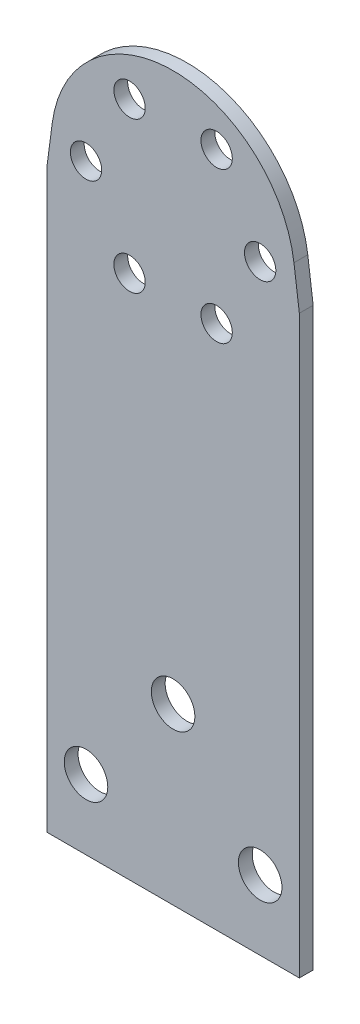
ISO-10303-21;
HEADER;
FILE_DESCRIPTION(('STEP AP214'),'2;1');
FILE_NAME('part.step','',(''),(''),'','','');
FILE_SCHEMA(('AUTOMOTIVE_DESIGN { 1 0 10303 214 1 1 1 1 }'));
ENDSEC;
DATA;
#1=APPLICATION_CONTEXT('core data for automotive mechanical design processes');
#2=APPLICATION_PROTOCOL_DEFINITION('international standard','automotive_design',2000,#1);
#3=PRODUCT_CONTEXT('',#1,'mechanical');
#4=PRODUCT('Part','Part','',(#3));
#5=PRODUCT_RELATED_PRODUCT_CATEGORY('part','',(#4));
#6=PRODUCT_DEFINITION_FORMATION('','',#4);
#7=PRODUCT_DEFINITION_CONTEXT('part definition',#1,'design');
#8=PRODUCT_DEFINITION('design','',#6,#7);
#9=PRODUCT_DEFINITION_SHAPE('','',#8);
#10=(LENGTH_UNIT() NAMED_UNIT(*) SI_UNIT(.MILLI.,.METRE.));
#11=(NAMED_UNIT(*) PLANE_ANGLE_UNIT() SI_UNIT($,.RADIAN.));
#12=(NAMED_UNIT(*) SI_UNIT($,.STERADIAN.) SOLID_ANGLE_UNIT());
#13=UNCERTAINTY_MEASURE_WITH_UNIT(LENGTH_MEASURE(1.E-05),#10,'distance_accuracy_value','');
#14=(GEOMETRIC_REPRESENTATION_CONTEXT(3) GLOBAL_UNCERTAINTY_ASSIGNED_CONTEXT((#13)) GLOBAL_UNIT_ASSIGNED_CONTEXT((#10,
#11,#12)) REPRESENTATION_CONTEXT('',''));
#15=CARTESIAN_POINT('',(0.,0.,0.));
#16=DIRECTION('',(0.,0.,1.));
#17=DIRECTION('',(1.,0.,0.));
#18=AXIS2_PLACEMENT_3D('',#15,#16,#17);
#19=CARTESIAN_POINT('',(0.,0.,0.79375));
#20=DIRECTION('',(0.,0.,1.));
#21=DIRECTION('',(1.,0.,0.));
#22=AXIS2_PLACEMENT_3D('',#19,#20,#21);
#23=PLANE('',#22);
#24=CARTESIAN_POINT('',(-5.,8.66025403784439,0.793750000000001));
#25=DIRECTION('',(0.,0.,1.));
#26=DIRECTION('',(1.,0.,0.));
#27=AXIS2_PLACEMENT_3D('',#24,#25,#26);
#28=CIRCLE('',#27,1.79999999999999);
#29=CARTESIAN_POINT('',(-3.20000000000001,8.66025403784439,0.793750000000001));
#30=VERTEX_POINT('',#29);
#31=EDGE_CURVE('E188',#30,#30,#28,.T.);
#32=ORIENTED_EDGE('',*,*,#31,.F.);
#33=EDGE_LOOP('',(#32));
#34=FACE_BOUND('',#33,.T.);
#35=CARTESIAN_POINT('',(-10.,0.,0.793750000000001));
#36=DIRECTION('',(0.,0.,1.));
#37=DIRECTION('',(1.,0.,0.));
#38=AXIS2_PLACEMENT_3D('',#35,#36,#37);
#39=CIRCLE('',#38,1.79999999999999);
#40=CARTESIAN_POINT('',(-8.20000000000001,0.,0.793750000000001));
#41=VERTEX_POINT('',#40);
#42=EDGE_CURVE('E182',#41,#41,#39,.T.);
#43=ORIENTED_EDGE('',*,*,#42,.F.);
#44=EDGE_LOOP('',(#43));
#45=FACE_BOUND('',#44,.T.);
#46=CARTESIAN_POINT('',(-4.99999999999999,-8.66025403784439,0.793750000000001));
#47=DIRECTION('',(0.,0.,1.));
#48=DIRECTION('',(1.,0.,0.));
#49=AXIS2_PLACEMENT_3D('',#46,#47,#48);
#50=CIRCLE('',#49,1.79999999999999);
#51=CARTESIAN_POINT('',(-3.20000000000001,-8.66025403784439,0.793750000000001));
#52=VERTEX_POINT('',#51);
#53=EDGE_CURVE('E176',#52,#52,#50,.T.);
#54=ORIENTED_EDGE('',*,*,#53,.F.);
#55=EDGE_LOOP('',(#54));
#56=FACE_BOUND('',#55,.T.);
#57=CARTESIAN_POINT('',(5.,-8.66025403784439,0.793750000000001));
#58=DIRECTION('',(0.,0.,1.));
#59=DIRECTION('',(1.,0.,0.));
#60=AXIS2_PLACEMENT_3D('',#57,#58,#59);
#61=CIRCLE('',#60,1.79999999999999);
#62=CARTESIAN_POINT('',(6.79999999999999,-8.66025403784439,0.793750000000001));
#63=VERTEX_POINT('',#62);
#64=EDGE_CURVE('E170',#63,#63,#61,.T.);
#65=ORIENTED_EDGE('',*,*,#64,.F.);
#66=EDGE_LOOP('',(#65));
#67=FACE_BOUND('',#66,.T.);
#68=CARTESIAN_POINT('',(10.,0.,0.793750000000001));
#69=DIRECTION('',(0.,0.,1.));
#70=DIRECTION('',(1.,0.,0.));
#71=AXIS2_PLACEMENT_3D('',#68,#69,#70);
#72=CIRCLE('',#71,1.79999999999999);
#73=CARTESIAN_POINT('',(11.8,0.,0.793750000000001));
#74=VERTEX_POINT('',#73);
#75=EDGE_CURVE('E164',#74,#74,#72,.T.);
#76=ORIENTED_EDGE('',*,*,#75,.F.);
#77=EDGE_LOOP('',(#76));
#78=FACE_BOUND('',#77,.T.);
#79=CARTESIAN_POINT('',(5.,8.66025403784439,0.793750000000001));
#80=DIRECTION('',(0.,0.,1.));
#81=DIRECTION('',(1.,0.,0.));
#82=AXIS2_PLACEMENT_3D('',#79,#80,#81);
#83=CIRCLE('',#82,1.79999999999999);
#84=CARTESIAN_POINT('',(6.79999999999998,8.66025403784439,0.793750000000001));
#85=VERTEX_POINT('',#84);
#86=EDGE_CURVE('E158',#85,#85,#83,.T.);
#87=ORIENTED_EDGE('',*,*,#86,.F.);
#88=EDGE_LOOP('',(#87));
#89=FACE_BOUND('',#88,.T.);
#90=CARTESIAN_POINT('',(-10.,-61.,0.79375));
#91=DIRECTION('',(0.,0.,1.));
#92=DIRECTION('',(1.,0.,0.));
#93=AXIS2_PLACEMENT_3D('',#90,#91,#92);
#94=CIRCLE('',#93,2.5);
#95=CARTESIAN_POINT('',(-7.5,-61.,0.79375));
#96=VERTEX_POINT('',#95);
#97=EDGE_CURVE('E150',#96,#96,#94,.T.);
#98=ORIENTED_EDGE('',*,*,#97,.F.);
#99=EDGE_LOOP('',(#98));
#100=FACE_BOUND('',#99,.T.);
#101=CARTESIAN_POINT('',(0.,-49.,0.79375));
#102=DIRECTION('',(0.,0.,1.));
#103=DIRECTION('',(1.,0.,0.));
#104=AXIS2_PLACEMENT_3D('',#101,#102,#103);
#105=CIRCLE('',#104,2.5);
#106=CARTESIAN_POINT('',(2.5,-49.,0.79375));
#107=VERTEX_POINT('',#106);
#108=EDGE_CURVE('E144',#107,#107,#105,.T.);
#109=ORIENTED_EDGE('',*,*,#108,.F.);
#110=EDGE_LOOP('',(#109));
#111=FACE_BOUND('',#110,.T.);
#112=CARTESIAN_POINT('',(10.,-61.,0.79375));
#113=DIRECTION('',(0.,0.,1.));
#114=DIRECTION('',(1.,0.,0.));
#115=AXIS2_PLACEMENT_3D('',#112,#113,#114);
#116=CIRCLE('',#115,2.5);
#117=CARTESIAN_POINT('',(12.5,-61.,0.79375));
#118=VERTEX_POINT('',#117);
#119=EDGE_CURVE('E138',#118,#118,#116,.T.);
#120=ORIENTED_EDGE('',*,*,#119,.F.);
#121=EDGE_LOOP('',(#120));
#122=FACE_BOUND('',#121,.T.);
#123=DIRECTION('',(1.,0.,0.));
#124=VECTOR('',#123,1.);
#125=CARTESIAN_POINT('',(-17.5,-69.,0.79375));
#126=LINE('',#125,#124);
#127=CARTESIAN_POINT('',(-14.5,-69.,0.793750000000001));
#128=VERTEX_POINT('',#127);
#129=CARTESIAN_POINT('',(14.5,-69.,0.79375));
#130=VERTEX_POINT('',#129);
#131=EDGE_CURVE('E120',#128,#130,#126,.T.);
#132=ORIENTED_EDGE('',*,*,#131,.T.);
#133=DIRECTION('',(0.,1.,0.));
#134=VECTOR('',#133,1.);
#135=CARTESIAN_POINT('',(14.5,0.,0.79375));
#136=LINE('',#135,#134);
#137=CARTESIAN_POINT('',(14.5,-2.88214583735345,0.793750000000001));
#138=VERTEX_POINT('',#137);
#139=EDGE_CURVE('E49',#130,#138,#136,.T.);
#140=ORIENTED_EDGE('',*,*,#139,.T.);
#141=DIRECTION('',(-0.130475045144653,0.991451593671875,0.));
#142=VECTOR('',#141,1.);
#143=CARTESIAN_POINT('',(22.4572579683594,-63.3476247742767,0.79375));
#144=LINE('',#143,#142);
#145=CARTESIAN_POINT('',(13.8803223114063,1.82665063202515,0.79375));
#146=VERTEX_POINT('',#145);
#147=EDGE_CURVE('E100',#138,#146,#144,.T.);
#148=ORIENTED_EDGE('',*,*,#147,.T.);
#149=CARTESIAN_POINT('',(0.,0.,0.79375));
#150=DIRECTION('',(0.,0.,1.));
#151=DIRECTION('',(1.,0.,0.));
#152=AXIS2_PLACEMENT_3D('',#149,#150,#151);
#153=CIRCLE('',#152,14.);
#154=CARTESIAN_POINT('',(-13.8803223114063,1.82665063202515,0.79375));
#155=VERTEX_POINT('',#154);
#156=EDGE_CURVE('E126',#146,#155,#153,.T.);
#157=ORIENTED_EDGE('',*,*,#156,.T.);
#158=DIRECTION('',(-0.130475045144653,-0.991451593671875,0.));
#159=VECTOR('',#158,1.);
#160=CARTESIAN_POINT('',(-13.8803223114063,1.82665063202515,0.79375));
#161=LINE('',#160,#159);
#162=CARTESIAN_POINT('',(-14.5,-2.88214583735345,0.79375));
#163=VERTEX_POINT('',#162);
#164=EDGE_CURVE('E117',#155,#163,#161,.T.);
#165=ORIENTED_EDGE('',*,*,#164,.T.);
#166=DIRECTION('',(0.,1.,0.));
#167=VECTOR('',#166,1.);
#168=CARTESIAN_POINT('',(-14.5,0.,0.79375));
#169=LINE('',#168,#167);
#170=EDGE_CURVE('E56',#128,#163,#169,.T.);
#171=ORIENTED_EDGE('',*,*,#170,.F.);
#172=EDGE_LOOP('',(#132,#140,#148,#157,#165,#171));
#173=FACE_BOUND('',#172,.T.);
#174=ADVANCED_FACE('F34',(#34,#45,#56,#67,#78,#89,#100,#111,#122,#173),#23,.T.);
#175=CARTESIAN_POINT('',(0.,0.,-0.79375));
#176=DIRECTION('',(0.,0.,1.));
#177=DIRECTION('',(1.,0.,0.));
#178=AXIS2_PLACEMENT_3D('',#175,#176,#177);
#179=PLANE('',#178);
#180=CARTESIAN_POINT('',(10.,-61.,-0.79375));
#181=DIRECTION('',(0.,0.,1.));
#182=DIRECTION('',(1.,0.,0.));
#183=AXIS2_PLACEMENT_3D('',#180,#181,#182);
#184=CIRCLE('',#183,2.5);
#185=CARTESIAN_POINT('',(12.5,-61.,-0.79375));
#186=VERTEX_POINT('',#185);
#187=EDGE_CURVE('E121',#186,#186,#184,.T.);
#188=ORIENTED_EDGE('',*,*,#187,.T.);
#189=EDGE_LOOP('',(#188));
#190=FACE_BOUND('',#189,.T.);
#191=CARTESIAN_POINT('',(0.,-49.,-0.79375));
#192=DIRECTION('',(0.,0.,1.));
#193=DIRECTION('',(1.,0.,0.));
#194=AXIS2_PLACEMENT_3D('',#191,#192,#193);
#195=CIRCLE('',#194,2.5);
#196=CARTESIAN_POINT('',(2.5,-49.,-0.79375));
#197=VERTEX_POINT('',#196);
#198=EDGE_CURVE('E141',#197,#197,#195,.T.);
#199=ORIENTED_EDGE('',*,*,#198,.T.);
#200=EDGE_LOOP('',(#199));
#201=FACE_BOUND('',#200,.T.);
#202=CARTESIAN_POINT('',(-10.,-61.,-0.79375));
#203=DIRECTION('',(0.,0.,1.));
#204=DIRECTION('',(1.,0.,0.));
#205=AXIS2_PLACEMENT_3D('',#202,#203,#204);
#206=CIRCLE('',#205,2.5);
#207=CARTESIAN_POINT('',(-7.5,-61.,-0.79375));
#208=VERTEX_POINT('',#207);
#209=EDGE_CURVE('E147',#208,#208,#206,.T.);
#210=ORIENTED_EDGE('',*,*,#209,.T.);
#211=EDGE_LOOP('',(#210));
#212=FACE_BOUND('',#211,.T.);
#213=CARTESIAN_POINT('',(5.,8.66025403784439,-0.79375));
#214=DIRECTION('',(0.,0.,1.));
#215=DIRECTION('',(1.,0.,0.));
#216=AXIS2_PLACEMENT_3D('',#213,#214,#215);
#217=CIRCLE('',#216,1.8);
#218=CARTESIAN_POINT('',(6.8,8.66025403784439,-0.79375));
#219=VERTEX_POINT('',#218);
#220=EDGE_CURVE('E153',#219,#219,#217,.T.);
#221=ORIENTED_EDGE('',*,*,#220,.T.);
#222=EDGE_LOOP('',(#221));
#223=FACE_BOUND('',#222,.T.);
#224=CARTESIAN_POINT('',(10.,0.,-0.79375));
#225=DIRECTION('',(0.,0.,1.));
#226=DIRECTION('',(1.,0.,0.));
#227=AXIS2_PLACEMENT_3D('',#224,#225,#226);
#228=CIRCLE('',#227,1.8);
#229=CARTESIAN_POINT('',(11.8,0.,-0.79375));
#230=VERTEX_POINT('',#229);
#231=EDGE_CURVE('E161',#230,#230,#228,.T.);
#232=ORIENTED_EDGE('',*,*,#231,.T.);
#233=EDGE_LOOP('',(#232));
#234=FACE_BOUND('',#233,.T.);
#235=CARTESIAN_POINT('',(5.,-8.66025403784439,-0.79375));
#236=DIRECTION('',(0.,0.,1.));
#237=DIRECTION('',(1.,0.,0.));
#238=AXIS2_PLACEMENT_3D('',#235,#236,#237);
#239=CIRCLE('',#238,1.8);
#240=CARTESIAN_POINT('',(6.8,-8.66025403784439,-0.79375));
#241=VERTEX_POINT('',#240);
#242=EDGE_CURVE('E167',#241,#241,#239,.T.);
#243=ORIENTED_EDGE('',*,*,#242,.T.);
#244=EDGE_LOOP('',(#243));
#245=FACE_BOUND('',#244,.T.);
#246=CARTESIAN_POINT('',(-4.99999999999999,-8.66025403784439,-0.79375));
#247=DIRECTION('',(0.,0.,1.));
#248=DIRECTION('',(1.,0.,0.));
#249=AXIS2_PLACEMENT_3D('',#246,#247,#248);
#250=CIRCLE('',#249,1.8);
#251=CARTESIAN_POINT('',(-3.19999999999999,-8.66025403784439,-0.79375));
#252=VERTEX_POINT('',#251);
#253=EDGE_CURVE('E173',#252,#252,#250,.T.);
#254=ORIENTED_EDGE('',*,*,#253,.T.);
#255=EDGE_LOOP('',(#254));
#256=FACE_BOUND('',#255,.T.);
#257=CARTESIAN_POINT('',(-10.,0.,-0.79375));
#258=DIRECTION('',(0.,0.,1.));
#259=DIRECTION('',(1.,0.,0.));
#260=AXIS2_PLACEMENT_3D('',#257,#258,#259);
#261=CIRCLE('',#260,1.8);
#262=CARTESIAN_POINT('',(-8.2,0.,-0.79375));
#263=VERTEX_POINT('',#262);
#264=EDGE_CURVE('E179',#263,#263,#261,.T.);
#265=ORIENTED_EDGE('',*,*,#264,.T.);
#266=EDGE_LOOP('',(#265));
#267=FACE_BOUND('',#266,.T.);
#268=CARTESIAN_POINT('',(-5.,8.66025403784439,-0.79375));
#269=DIRECTION('',(0.,0.,1.));
#270=DIRECTION('',(1.,0.,0.));
#271=AXIS2_PLACEMENT_3D('',#268,#269,#270);
#272=CIRCLE('',#271,1.8);
#273=CARTESIAN_POINT('',(-3.2,8.66025403784439,-0.79375));
#274=VERTEX_POINT('',#273);
#275=EDGE_CURVE('E185',#274,#274,#272,.T.);
#276=ORIENTED_EDGE('',*,*,#275,.T.);
#277=EDGE_LOOP('',(#276));
#278=FACE_BOUND('',#277,.T.);
#279=DIRECTION('',(0.,-1.,0.));
#280=VECTOR('',#279,1.);
#281=CARTESIAN_POINT('',(14.5,0.,-0.79375));
#282=LINE('',#281,#280);
#283=CARTESIAN_POINT('',(14.5,-2.88214583735345,-0.79375));
#284=VERTEX_POINT('',#283);
#285=CARTESIAN_POINT('',(14.5,-69.,-0.79375));
#286=VERTEX_POINT('',#285);
#287=EDGE_CURVE('E84',#284,#286,#282,.T.);
#288=ORIENTED_EDGE('',*,*,#287,.T.);
#289=DIRECTION('',(1.,0.,0.));
#290=VECTOR('',#289,1.);
#291=CARTESIAN_POINT('',(-17.5,-69.,-0.79375));
#292=LINE('',#291,#290);
#293=CARTESIAN_POINT('',(-14.5,-69.,-0.79375));
#294=VERTEX_POINT('',#293);
#295=EDGE_CURVE('E108',#294,#286,#292,.T.);
#296=ORIENTED_EDGE('',*,*,#295,.F.);
#297=DIRECTION('',(0.,-1.,0.));
#298=VECTOR('',#297,1.);
#299=CARTESIAN_POINT('',(-14.5,0.,-0.79375));
#300=LINE('',#299,#298);
#301=CARTESIAN_POINT('',(-14.5,-2.88214583735345,-0.79375));
#302=VERTEX_POINT('',#301);
#303=EDGE_CURVE('E131',#302,#294,#300,.T.);
#304=ORIENTED_EDGE('',*,*,#303,.F.);
#305=DIRECTION('',(-0.130475045144653,-0.991451593671875,0.));
#306=VECTOR('',#305,1.);
#307=CARTESIAN_POINT('',(-13.8803223114063,1.82665063202515,-0.79375));
#308=LINE('',#307,#306);
#309=CARTESIAN_POINT('',(-13.8803223114063,1.82665063202515,-0.79375));
#310=VERTEX_POINT('',#309);
#311=EDGE_CURVE('E113',#310,#302,#308,.T.);
#312=ORIENTED_EDGE('',*,*,#311,.F.);
#313=CARTESIAN_POINT('',(0.,0.,-0.79375));
#314=DIRECTION('',(0.,0.,1.));
#315=DIRECTION('',(1.,0.,0.));
#316=AXIS2_PLACEMENT_3D('',#313,#314,#315);
#317=CIRCLE('',#316,14.);
#318=CARTESIAN_POINT('',(13.8803223114063,1.82665063202515,-0.79375));
#319=VERTEX_POINT('',#318);
#320=EDGE_CURVE('E106',#319,#310,#317,.T.);
#321=ORIENTED_EDGE('',*,*,#320,.F.);
#322=DIRECTION('',(-0.130475045144653,0.991451593671875,0.));
#323=VECTOR('',#322,1.);
#324=CARTESIAN_POINT('',(22.4572579683594,-63.3476247742767,-0.79375));
#325=LINE('',#324,#323);
#326=EDGE_CURVE('E98',#284,#319,#325,.T.);
#327=ORIENTED_EDGE('',*,*,#326,.F.);
#328=EDGE_LOOP('',(#288,#296,#304,#312,#321,#327));
#329=FACE_BOUND('',#328,.T.);
#330=ADVANCED_FACE('F103',(#190,#201,#212,#223,#234,#245,#256,#267,#278,#329),#179,.F.);
#331=CARTESIAN_POINT('',(22.4572579683594,-63.3476247742767,-0.79375));
#332=DIRECTION('',(0.991451593671875,0.130475045144653,0.));
#333=DIRECTION('',(-0.130475045144653,0.991451593671875,0.));
#334=AXIS2_PLACEMENT_3D('',#331,#332,#333);
#335=PLANE('',#334);
#336=ORIENTED_EDGE('',*,*,#147,.F.);
#337=DIRECTION('',(0.,0.,-1.));
#338=VECTOR('',#337,1.);
#339=CARTESIAN_POINT('',(14.5,-2.88214583735345,9.20625));
#340=LINE('',#339,#338);
#341=EDGE_CURVE('E87',#138,#284,#340,.T.);
#342=ORIENTED_EDGE('',*,*,#341,.T.);
#343=ORIENTED_EDGE('',*,*,#326,.T.);
#344=DIRECTION('',(0.,0.,1.));
#345=VECTOR('',#344,1.);
#346=CARTESIAN_POINT('',(13.8803223114063,1.82665063202515,-0.79375));
#347=LINE('',#346,#345);
#348=EDGE_CURVE('E111',#319,#146,#347,.T.);
#349=ORIENTED_EDGE('',*,*,#348,.T.);
#350=EDGE_LOOP('',(#336,#342,#343,#349));
#351=FACE_BOUND('',#350,.T.);
#352=ADVANCED_FACE('F96',(#351),#335,.T.);
#353=CARTESIAN_POINT('',(-17.5,-69.,-0.79375));
#354=DIRECTION('',(0.,-1.,0.));
#355=DIRECTION('',(0.,0.,-1.));
#356=AXIS2_PLACEMENT_3D('',#353,#354,#355);
#357=PLANE('',#356);
#358=ORIENTED_EDGE('',*,*,#295,.T.);
#359=DIRECTION('',(0.,0.,1.));
#360=VECTOR('',#359,1.);
#361=CARTESIAN_POINT('',(14.5,-69.,-0.79375));
#362=LINE('',#361,#360);
#363=EDGE_CURVE('E11',#286,#130,#362,.T.);
#364=ORIENTED_EDGE('',*,*,#363,.T.);
#365=ORIENTED_EDGE('',*,*,#131,.F.);
#366=DIRECTION('',(0.,0.,-1.));
#367=VECTOR('',#366,1.);
#368=CARTESIAN_POINT('',(-14.5,-69.,9.20625));
#369=LINE('',#368,#367);
#370=EDGE_CURVE('E92',#128,#294,#369,.T.);
#371=ORIENTED_EDGE('',*,*,#370,.T.);
#372=EDGE_LOOP('',(#358,#364,#365,#371));
#373=FACE_BOUND('',#372,.T.);
#374=ADVANCED_FACE('F195',(#373),#357,.T.);
#375=CARTESIAN_POINT('',(0.,0.,0.79375));
#376=DIRECTION('',(0.,0.,-1.));
#377=DIRECTION('',(-1.,0.,0.));
#378=AXIS2_PLACEMENT_3D('',#375,#376,#377);
#379=CYLINDRICAL_SURFACE('',#378,14.);
#380=ORIENTED_EDGE('',*,*,#156,.F.);
#381=ORIENTED_EDGE('',*,*,#348,.F.);
#382=ORIENTED_EDGE('',*,*,#320,.T.);
#383=DIRECTION('',(0.,0.,1.));
#384=VECTOR('',#383,1.);
#385=CARTESIAN_POINT('',(-13.8803223114063,1.82665063202515,-0.79375));
#386=LINE('',#385,#384);
#387=EDGE_CURVE('E107',#310,#155,#386,.T.);
#388=ORIENTED_EDGE('',*,*,#387,.T.);
#389=EDGE_LOOP('',(#380,#381,#382,#388));
#390=FACE_BOUND('',#389,.T.);
#391=ADVANCED_FACE('F36',(#390),#379,.T.);
#392=CARTESIAN_POINT('',(-13.8803223114063,1.82665063202515,-0.79375));
#393=DIRECTION('',(-0.991451593671875,0.130475045144653,0.));
#394=DIRECTION('',(-0.130475045144653,-0.991451593671875,0.));
#395=AXIS2_PLACEMENT_3D('',#392,#393,#394);
#396=PLANE('',#395);
#397=DIRECTION('',(0.,0.,-1.));
#398=VECTOR('',#397,1.);
#399=CARTESIAN_POINT('',(-14.5,-2.88214583735345,-0.79375));
#400=LINE('',#399,#398);
#401=EDGE_CURVE('E42',#163,#302,#400,.T.);
#402=ORIENTED_EDGE('',*,*,#401,.F.);
#403=ORIENTED_EDGE('',*,*,#164,.F.);
#404=ORIENTED_EDGE('',*,*,#387,.F.);
#405=ORIENTED_EDGE('',*,*,#311,.T.);
#406=EDGE_LOOP('',(#402,#403,#404,#405));
#407=FACE_BOUND('',#406,.T.);
#408=ADVANCED_FACE('F136',(#407),#396,.T.);
#409=CARTESIAN_POINT('',(10.,-61.,-0.79375));
#410=DIRECTION('',(0.,0.,1.));
#411=DIRECTION('',(1.,0.,0.));
#412=AXIS2_PLACEMENT_3D('',#409,#410,#411);
#413=CYLINDRICAL_SURFACE('',#412,2.5);
#414=ORIENTED_EDGE('',*,*,#187,.F.);
#415=EDGE_LOOP('',(#414));
#416=FACE_BOUND('',#415,.T.);
#417=ORIENTED_EDGE('',*,*,#119,.T.);
#418=EDGE_LOOP('',(#417));
#419=FACE_BOUND('',#418,.T.);
#420=ADVANCED_FACE('F204',(#416,#419),#413,.F.);
#421=CARTESIAN_POINT('',(0.,-49.,-0.79375));
#422=DIRECTION('',(0.,0.,1.));
#423=DIRECTION('',(1.,0.,0.));
#424=AXIS2_PLACEMENT_3D('',#421,#422,#423);
#425=CYLINDRICAL_SURFACE('',#424,2.5);
#426=ORIENTED_EDGE('',*,*,#198,.F.);
#427=EDGE_LOOP('',(#426));
#428=FACE_BOUND('',#427,.T.);
#429=ORIENTED_EDGE('',*,*,#108,.T.);
#430=EDGE_LOOP('',(#429));
#431=FACE_BOUND('',#430,.T.);
#432=ADVANCED_FACE('F221',(#428,#431),#425,.F.);
#433=CARTESIAN_POINT('',(-10.,-61.,-0.79375));
#434=DIRECTION('',(0.,0.,1.));
#435=DIRECTION('',(1.,0.,0.));
#436=AXIS2_PLACEMENT_3D('',#433,#434,#435);
#437=CYLINDRICAL_SURFACE('',#436,2.5);
#438=ORIENTED_EDGE('',*,*,#209,.F.);
#439=EDGE_LOOP('',(#438));
#440=FACE_BOUND('',#439,.T.);
#441=ORIENTED_EDGE('',*,*,#97,.T.);
#442=EDGE_LOOP('',(#441));
#443=FACE_BOUND('',#442,.T.);
#444=ADVANCED_FACE('F225',(#440,#443),#437,.F.);
#445=CARTESIAN_POINT('',(5.,8.66025403784439,0.79375));
#446=DIRECTION('',(0.,0.,1.));
#447=DIRECTION('',(1.,0.,0.));
#448=AXIS2_PLACEMENT_3D('',#445,#446,#447);
#449=CYLINDRICAL_SURFACE('',#448,1.79999999999999);
#450=ORIENTED_EDGE('',*,*,#220,.F.);
#451=EDGE_LOOP('',(#450));
#452=FACE_BOUND('',#451,.T.);
#453=ORIENTED_EDGE('',*,*,#86,.T.);
#454=EDGE_LOOP('',(#453));
#455=FACE_BOUND('',#454,.T.);
#456=ADVANCED_FACE('F229',(#452,#455),#449,.F.);
#457=CARTESIAN_POINT('',(10.,0.,0.79375));
#458=DIRECTION('',(0.,0.,1.));
#459=DIRECTION('',(1.,0.,0.));
#460=AXIS2_PLACEMENT_3D('',#457,#458,#459);
#461=CYLINDRICAL_SURFACE('',#460,1.79999999999999);
#462=ORIENTED_EDGE('',*,*,#231,.F.);
#463=EDGE_LOOP('',(#462));
#464=FACE_BOUND('',#463,.T.);
#465=ORIENTED_EDGE('',*,*,#75,.T.);
#466=EDGE_LOOP('',(#465));
#467=FACE_BOUND('',#466,.T.);
#468=ADVANCED_FACE('F233',(#464,#467),#461,.F.);
#469=CARTESIAN_POINT('',(5.,-8.66025403784439,0.79375));
#470=DIRECTION('',(0.,0.,1.));
#471=DIRECTION('',(1.,0.,0.));
#472=AXIS2_PLACEMENT_3D('',#469,#470,#471);
#473=CYLINDRICAL_SURFACE('',#472,1.79999999999999);
#474=ORIENTED_EDGE('',*,*,#242,.F.);
#475=EDGE_LOOP('',(#474));
#476=FACE_BOUND('',#475,.T.);
#477=ORIENTED_EDGE('',*,*,#64,.T.);
#478=EDGE_LOOP('',(#477));
#479=FACE_BOUND('',#478,.T.);
#480=ADVANCED_FACE('F237',(#476,#479),#473,.F.);
#481=CARTESIAN_POINT('',(-4.99999999999999,-8.66025403784439,0.79375));
#482=DIRECTION('',(0.,0.,1.));
#483=DIRECTION('',(1.,0.,0.));
#484=AXIS2_PLACEMENT_3D('',#481,#482,#483);
#485=CYLINDRICAL_SURFACE('',#484,1.79999999999999);
#486=ORIENTED_EDGE('',*,*,#253,.F.);
#487=EDGE_LOOP('',(#486));
#488=FACE_BOUND('',#487,.T.);
#489=ORIENTED_EDGE('',*,*,#53,.T.);
#490=EDGE_LOOP('',(#489));
#491=FACE_BOUND('',#490,.T.);
#492=ADVANCED_FACE('F241',(#488,#491),#485,.F.);
#493=CARTESIAN_POINT('',(-10.,0.,0.79375));
#494=DIRECTION('',(0.,0.,1.));
#495=DIRECTION('',(1.,0.,0.));
#496=AXIS2_PLACEMENT_3D('',#493,#494,#495);
#497=CYLINDRICAL_SURFACE('',#496,1.79999999999999);
#498=ORIENTED_EDGE('',*,*,#264,.F.);
#499=EDGE_LOOP('',(#498));
#500=FACE_BOUND('',#499,.T.);
#501=ORIENTED_EDGE('',*,*,#42,.T.);
#502=EDGE_LOOP('',(#501));
#503=FACE_BOUND('',#502,.T.);
#504=ADVANCED_FACE('F245',(#500,#503),#497,.F.);
#505=CARTESIAN_POINT('',(-5.,8.66025403784439,0.79375));
#506=DIRECTION('',(0.,0.,1.));
#507=DIRECTION('',(1.,0.,0.));
#508=AXIS2_PLACEMENT_3D('',#505,#506,#507);
#509=CYLINDRICAL_SURFACE('',#508,1.79999999999999);
#510=ORIENTED_EDGE('',*,*,#275,.F.);
#511=EDGE_LOOP('',(#510));
#512=FACE_BOUND('',#511,.T.);
#513=ORIENTED_EDGE('',*,*,#31,.T.);
#514=EDGE_LOOP('',(#513));
#515=FACE_BOUND('',#514,.T.);
#516=ADVANCED_FACE('F249',(#512,#515),#509,.F.);
#517=CARTESIAN_POINT('',(-14.5,0.,9.20625));
#518=DIRECTION('',(1.,0.,0.));
#519=DIRECTION('',(0.,1.,0.));
#520=AXIS2_PLACEMENT_3D('',#517,#518,#519);
#521=PLANE('',#520);
#522=ORIENTED_EDGE('',*,*,#170,.T.);
#523=ORIENTED_EDGE('',*,*,#401,.T.);
#524=ORIENTED_EDGE('',*,*,#303,.T.);
#525=ORIENTED_EDGE('',*,*,#370,.F.);
#526=EDGE_LOOP('',(#522,#523,#524,#525));
#527=FACE_BOUND('',#526,.T.);
#528=ADVANCED_FACE('F130',(#527),#521,.F.);
#529=CARTESIAN_POINT('',(14.5,0.,9.20625));
#530=DIRECTION('',(1.,0.,0.));
#531=DIRECTION('',(0.,1.,0.));
#532=AXIS2_PLACEMENT_3D('',#529,#530,#531);
#533=PLANE('',#532);
#534=ORIENTED_EDGE('',*,*,#363,.F.);
#535=ORIENTED_EDGE('',*,*,#287,.F.);
#536=ORIENTED_EDGE('',*,*,#341,.F.);
#537=ORIENTED_EDGE('',*,*,#139,.F.);
#538=EDGE_LOOP('',(#534,#535,#536,#537));
#539=FACE_BOUND('',#538,.T.);
#540=ADVANCED_FACE('F86',(#539),#533,.T.);
#541=CLOSED_SHELL('',(#174,#330,#352,#374,#391,#408,#420,#432,#444,#456,#468,#480,#492,#504,
#516,#528,#540));
#542=MANIFOLD_SOLID_BREP('B2',#541);
#543=ADVANCED_BREP_SHAPE_REPRESENTATION('',(#18,#542),#14);
#544=SHAPE_DEFINITION_REPRESENTATION(#9,#543);
ENDSEC;
END-ISO-10303-21;
